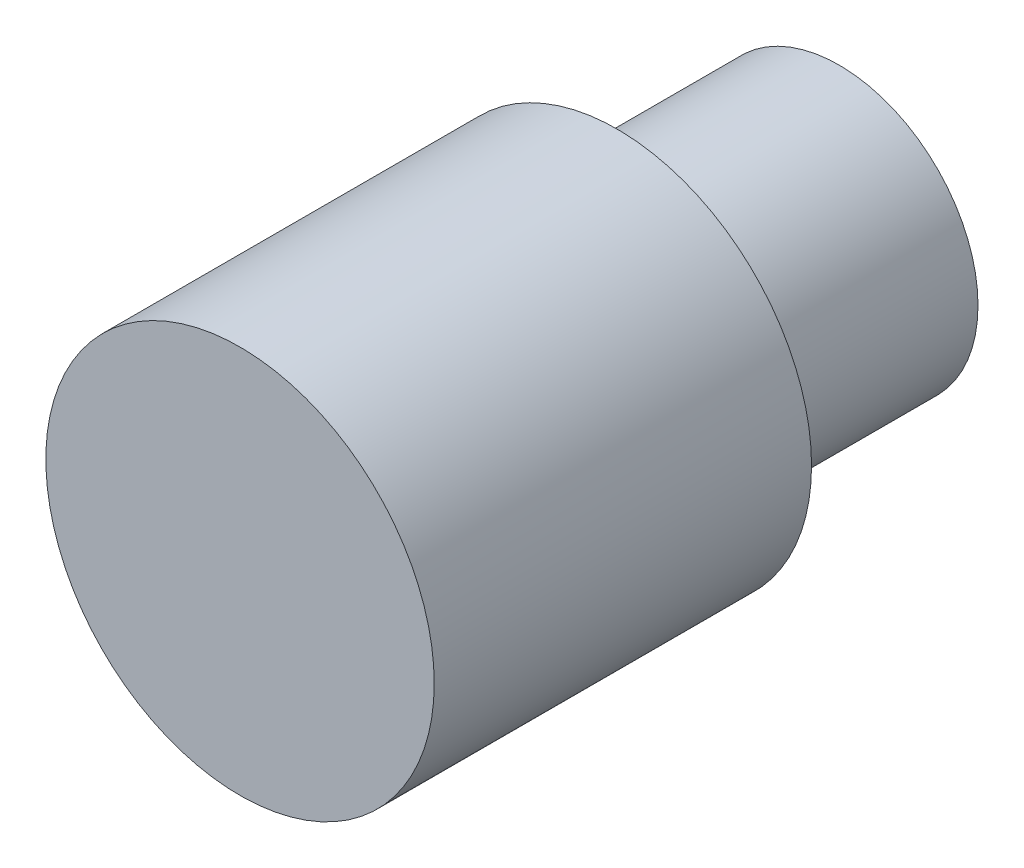
ISO-10303-21;
HEADER;
FILE_DESCRIPTION(('STEP AP214'),'2;1');
FILE_NAME('part.step','',(''),(''),'','','');
FILE_SCHEMA(('AUTOMOTIVE_DESIGN { 1 0 10303 214 1 1 1 1 }'));
ENDSEC;
DATA;
#1=APPLICATION_CONTEXT('core data for automotive mechanical design processes');
#2=APPLICATION_PROTOCOL_DEFINITION('international standard','automotive_design',2000,#1);
#3=PRODUCT_CONTEXT('',#1,'mechanical');
#4=PRODUCT('Part','Part','',(#3));
#5=PRODUCT_RELATED_PRODUCT_CATEGORY('part','',(#4));
#6=PRODUCT_DEFINITION_FORMATION('','',#4);
#7=PRODUCT_DEFINITION_CONTEXT('part definition',#1,'design');
#8=PRODUCT_DEFINITION('design','',#6,#7);
#9=PRODUCT_DEFINITION_SHAPE('','',#8);
#10=(LENGTH_UNIT() NAMED_UNIT(*) SI_UNIT(.MILLI.,.METRE.));
#11=(NAMED_UNIT(*) PLANE_ANGLE_UNIT() SI_UNIT($,.RADIAN.));
#12=(NAMED_UNIT(*) SI_UNIT($,.STERADIAN.) SOLID_ANGLE_UNIT());
#13=UNCERTAINTY_MEASURE_WITH_UNIT(LENGTH_MEASURE(1.E-05),#10,'distance_accuracy_value','');
#14=(GEOMETRIC_REPRESENTATION_CONTEXT(3) GLOBAL_UNCERTAINTY_ASSIGNED_CONTEXT((#13)) GLOBAL_UNIT_ASSIGNED_CONTEXT((#10,
#11,#12)) REPRESENTATION_CONTEXT('',''));
#15=CARTESIAN_POINT('',(0.,0.,0.));
#16=DIRECTION('',(0.,0.,1.));
#17=DIRECTION('',(1.,0.,0.));
#18=AXIS2_PLACEMENT_3D('',#15,#16,#17);
#19=CARTESIAN_POINT('',(0.,0.,20.));
#20=DIRECTION('',(0.,0.,-1.));
#21=DIRECTION('',(-1.,0.,0.));
#22=AXIS2_PLACEMENT_3D('',#19,#20,#21);
#23=CYLINDRICAL_SURFACE('',#22,12.5);
#24=CARTESIAN_POINT('',(0.,0.,20.));
#25=DIRECTION('',(0.,0.,1.));
#26=DIRECTION('',(1.,0.,0.));
#27=AXIS2_PLACEMENT_3D('',#24,#25,#26);
#28=CIRCLE('',#27,12.5);
#29=CARTESIAN_POINT('',(12.5,0.,20.));
#30=VERTEX_POINT('',#29);
#31=EDGE_CURVE('E10',#30,#30,#28,.T.);
#32=ORIENTED_EDGE('',*,*,#31,.F.);
#33=EDGE_LOOP('',(#32));
#34=FACE_BOUND('',#33,.T.);
#35=CARTESIAN_POINT('',(0.,0.,0.));
#36=DIRECTION('',(0.,0.,1.));
#37=DIRECTION('',(1.,0.,0.));
#38=AXIS2_PLACEMENT_3D('',#35,#36,#37);
#39=CIRCLE('',#38,12.5);
#40=CARTESIAN_POINT('',(12.5,0.,0.));
#41=VERTEX_POINT('',#40);
#42=EDGE_CURVE('E40',#41,#41,#39,.T.);
#43=ORIENTED_EDGE('',*,*,#42,.T.);
#44=EDGE_LOOP('',(#43));
#45=FACE_BOUND('',#44,.T.);
#46=ADVANCED_FACE('F37',(#34,#45),#23,.T.);
#47=CARTESIAN_POINT('',(0.,0.,0.));
#48=DIRECTION('',(0.,0.,1.));
#49=DIRECTION('',(1.,0.,0.));
#50=AXIS2_PLACEMENT_3D('',#47,#48,#49);
#51=PLANE('',#50);
#52=ORIENTED_EDGE('',*,*,#42,.F.);
#53=EDGE_LOOP('',(#52));
#54=FACE_BOUND('',#53,.T.);
#55=ADVANCED_FACE('F64',(#54),#51,.F.);
#56=CARTESIAN_POINT('',(0.,0.,54.));
#57=DIRECTION('',(0.,0.,-1.));
#58=DIRECTION('',(-1.,0.,0.));
#59=AXIS2_PLACEMENT_3D('',#56,#57,#58);
#60=CYLINDRICAL_SURFACE('',#59,17.5);
#61=CARTESIAN_POINT('',(0.,0.,54.));
#62=DIRECTION('',(0.,0.,1.));
#63=DIRECTION('',(1.,0.,0.));
#64=AXIS2_PLACEMENT_3D('',#61,#62,#63);
#65=CIRCLE('',#64,17.5);
#66=CARTESIAN_POINT('',(17.5,0.,54.));
#67=VERTEX_POINT('',#66);
#68=EDGE_CURVE('E49',#67,#67,#65,.T.);
#69=ORIENTED_EDGE('',*,*,#68,.F.);
#70=EDGE_LOOP('',(#69));
#71=FACE_BOUND('',#70,.T.);
#72=CARTESIAN_POINT('',(0.,0.,20.));
#73=DIRECTION('',(0.,0.,1.));
#74=DIRECTION('',(1.,0.,0.));
#75=AXIS2_PLACEMENT_3D('',#72,#73,#74);
#76=CIRCLE('',#75,17.5);
#77=CARTESIAN_POINT('',(17.5,0.,20.));
#78=VERTEX_POINT('',#77);
#79=EDGE_CURVE('E51',#78,#78,#76,.T.);
#80=ORIENTED_EDGE('',*,*,#79,.T.);
#81=EDGE_LOOP('',(#80));
#82=FACE_BOUND('',#81,.T.);
#83=ADVANCED_FACE('F61',(#71,#82),#60,.T.);
#84=CARTESIAN_POINT('',(0.,0.,54.));
#85=DIRECTION('',(0.,0.,1.));
#86=DIRECTION('',(1.,0.,0.));
#87=AXIS2_PLACEMENT_3D('',#84,#85,#86);
#88=PLANE('',#87);
#89=ORIENTED_EDGE('',*,*,#68,.T.);
#90=EDGE_LOOP('',(#89));
#91=FACE_BOUND('',#90,.T.);
#92=ADVANCED_FACE('F59',(#91),#88,.T.);
#93=CARTESIAN_POINT('',(0.,0.,20.));
#94=DIRECTION('',(0.,0.,1.));
#95=DIRECTION('',(1.,0.,0.));
#96=AXIS2_PLACEMENT_3D('',#93,#94,#95);
#97=PLANE('',#96);
#98=ORIENTED_EDGE('',*,*,#31,.T.);
#99=EDGE_LOOP('',(#98));
#100=FACE_BOUND('',#99,.T.);
#101=ORIENTED_EDGE('',*,*,#79,.F.);
#102=EDGE_LOOP('',(#101));
#103=FACE_BOUND('',#102,.T.);
#104=ADVANCED_FACE('F68',(#100,#103),#97,.F.);
#105=CLOSED_SHELL('',(#46,#55,#83,#92,#104));
#106=MANIFOLD_SOLID_BREP('B2',#105);
#107=ADVANCED_BREP_SHAPE_REPRESENTATION('',(#18,#106),#14);
#108=SHAPE_DEFINITION_REPRESENTATION(#9,#107);
ENDSEC;
END-ISO-10303-21;
